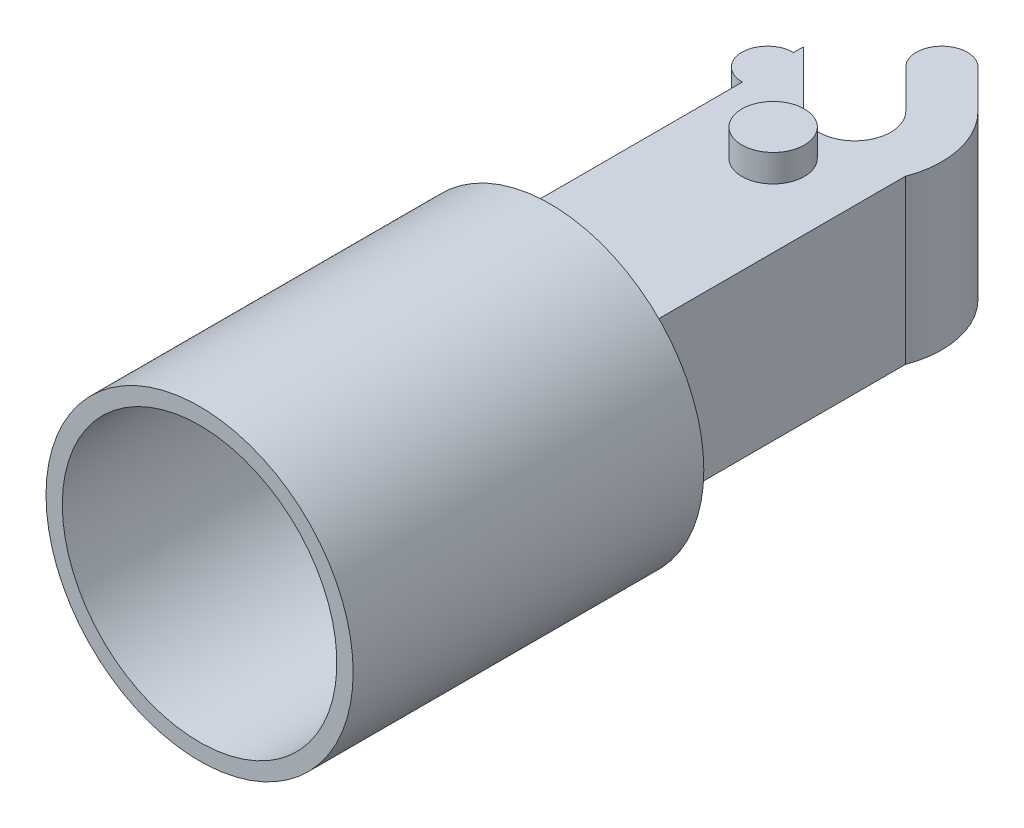
ISO-10303-21;
HEADER;
FILE_DESCRIPTION(('STEP AP214'),'2;1');
FILE_NAME('part.step','',(''),(''),'','','');
FILE_SCHEMA(('AUTOMOTIVE_DESIGN { 1 0 10303 214 1 1 1 1 }'));
ENDSEC;
DATA;
#1=APPLICATION_CONTEXT('core data for automotive mechanical design processes');
#2=APPLICATION_PROTOCOL_DEFINITION('international standard','automotive_design',2000,#1);
#3=PRODUCT_CONTEXT('',#1,'mechanical');
#4=PRODUCT('Part','Part','',(#3));
#5=PRODUCT_RELATED_PRODUCT_CATEGORY('part','',(#4));
#6=PRODUCT_DEFINITION_FORMATION('','',#4);
#7=PRODUCT_DEFINITION_CONTEXT('part definition',#1,'design');
#8=PRODUCT_DEFINITION('design','',#6,#7);
#9=PRODUCT_DEFINITION_SHAPE('','',#8);
#10=(LENGTH_UNIT() NAMED_UNIT(*) SI_UNIT(.MILLI.,.METRE.));
#11=(NAMED_UNIT(*) PLANE_ANGLE_UNIT() SI_UNIT($,.RADIAN.));
#12=(NAMED_UNIT(*) SI_UNIT($,.STERADIAN.) SOLID_ANGLE_UNIT());
#13=UNCERTAINTY_MEASURE_WITH_UNIT(LENGTH_MEASURE(1.E-05),#10,'distance_accuracy_value','');
#14=(GEOMETRIC_REPRESENTATION_CONTEXT(3) GLOBAL_UNCERTAINTY_ASSIGNED_CONTEXT((#13)) GLOBAL_UNIT_ASSIGNED_CONTEXT((#10,
#11,#12)) REPRESENTATION_CONTEXT('',''));
#15=CARTESIAN_POINT('',(0.,0.,0.));
#16=DIRECTION('',(0.,0.,1.));
#17=DIRECTION('',(1.,0.,0.));
#18=AXIS2_PLACEMENT_3D('',#15,#16,#17);
#19=CARTESIAN_POINT('',(-7.5,17.49,0.));
#20=DIRECTION('',(1.,0.,0.));
#21=DIRECTION('',(0.,0.,-1.));
#22=AXIS2_PLACEMENT_3D('',#19,#20,#21);
#23=PLANE('',#22);
#24=DIRECTION('',(0.,0.,1.));
#25=VECTOR('',#24,1.);
#26=CARTESIAN_POINT('',(-7.5,2.5,0.));
#27=LINE('',#26,#25);
#28=CARTESIAN_POINT('',(-7.5,2.5,-10.));
#29=VERTEX_POINT('',#28);
#30=CARTESIAN_POINT('',(-7.5,2.5,-9.37510898711377));
#31=VERTEX_POINT('',#30);
#32=EDGE_CURVE('E387',#29,#31,#27,.T.);
#33=ORIENTED_EDGE('',*,*,#32,.T.);
#34=DIRECTION('',(0.,-1.,0.));
#35=VECTOR('',#34,1.);
#36=CARTESIAN_POINT('',(-7.5,36.8519157616292,-9.37510898711377));
#37=LINE('',#36,#35);
#38=CARTESIAN_POINT('',(-7.5,17.49,-9.37510898711377));
#39=VERTEX_POINT('',#38);
#40=EDGE_CURVE('E477',#31,#39,#37,.F.);
#41=ORIENTED_EDGE('',*,*,#40,.T.);
#42=DIRECTION('',(0.,0.,1.));
#43=VECTOR('',#42,1.);
#44=CARTESIAN_POINT('',(-7.5,17.49,0.));
#45=LINE('',#44,#43);
#46=CARTESIAN_POINT('',(-7.5,17.49,-10.));
#47=VERTEX_POINT('',#46);
#48=EDGE_CURVE('E469',#47,#39,#45,.T.);
#49=ORIENTED_EDGE('',*,*,#48,.F.);
#50=DIRECTION('',(0.,-1.,0.));
#51=VECTOR('',#50,1.);
#52=CARTESIAN_POINT('',(-7.5,17.49,-10.));
#53=LINE('',#52,#51);
#54=EDGE_CURVE('E302',#47,#29,#53,.T.);
#55=ORIENTED_EDGE('',*,*,#54,.T.);
#56=EDGE_LOOP('',(#33,#41,#49,#55));
#57=FACE_BOUND('',#56,.T.);
#58=ADVANCED_FACE('F278',(#57),#23,.F.);
#59=CARTESIAN_POINT('',(0.,20.,0.));
#60=DIRECTION('',(0.,-1.,0.));
#61=DIRECTION('',(0.,0.,-1.));
#62=AXIS2_PLACEMENT_3D('',#59,#60,#61);
#63=CYLINDRICAL_SURFACE('',#62,2.875);
#64=CARTESIAN_POINT('',(0.,2.5,0.));
#65=DIRECTION('',(0.,-1.,0.));
#66=DIRECTION('',(0.,0.,-1.));
#67=AXIS2_PLACEMENT_3D('',#64,#65,#66);
#68=CIRCLE('',#67,2.875);
#69=CARTESIAN_POINT('',(0.,2.5,-2.875));
#70=VERTEX_POINT('',#69);
#71=EDGE_CURVE('E468',#70,#70,#68,.T.);
#72=ORIENTED_EDGE('',*,*,#71,.T.);
#73=EDGE_LOOP('',(#72));
#74=FACE_BOUND('',#73,.T.);
#75=CARTESIAN_POINT('',(0.,0.,0.));
#76=DIRECTION('',(0.,1.,0.));
#77=DIRECTION('',(0.,0.,1.));
#78=AXIS2_PLACEMENT_3D('',#75,#76,#77);
#79=CIRCLE('',#78,2.875);
#80=CARTESIAN_POINT('',(0.,0.,2.875));
#81=VERTEX_POINT('',#80);
#82=EDGE_CURVE('E401',#81,#81,#79,.T.);
#83=ORIENTED_EDGE('',*,*,#82,.T.);
#84=EDGE_LOOP('',(#83));
#85=FACE_BOUND('',#84,.T.);
#86=ADVANCED_FACE('F280',(#74,#85),#63,.T.);
#87=CARTESIAN_POINT('',(0.,0.,0.));
#88=DIRECTION('',(0.,1.,0.));
#89=DIRECTION('',(0.,0.,1.));
#90=AXIS2_PLACEMENT_3D('',#87,#88,#89);
#91=PLANE('',#90);
#92=ORIENTED_EDGE('',*,*,#82,.F.);
#93=EDGE_LOOP('',(#92));
#94=FACE_BOUND('',#93,.T.);
#95=ADVANCED_FACE('F435',(#94),#91,.F.);
#96=DIRECTION('',(0.,-1.,0.));
#97=VECTOR('',#96,1.);
#98=CARTESIAN_POINT('',(-7.5,42.8917715917611,20.5));
#99=LINE('',#98,#97);
#100=CARTESIAN_POINT('',(-7.5,17.49,20.5));
#101=VERTEX_POINT('',#100);
#102=CARTESIAN_POINT('',(-7.5,2.5,20.5));
#103=VERTEX_POINT('',#102);
#104=EDGE_CURVE('E393',#101,#103,#99,.T.);
#105=ORIENTED_EDGE('',*,*,#104,.F.);
#106=CARTESIAN_POINT('',(-7.5,17.49,-4.67599072275948));
#107=VERTEX_POINT('',#106);
#108=EDGE_CURVE('E452',#107,#101,#45,.T.);
#109=ORIENTED_EDGE('',*,*,#108,.F.);
#110=DIRECTION('',(0.,-1.,0.));
#111=VECTOR('',#110,1.);
#112=CARTESIAN_POINT('',(-7.5,36.8519157616292,-4.67599072275948));
#113=LINE('',#112,#111);
#114=CARTESIAN_POINT('',(-7.5,2.5,-4.67599072275948));
#115=VERTEX_POINT('',#114);
#116=EDGE_CURVE('E376',#107,#115,#113,.T.);
#117=ORIENTED_EDGE('',*,*,#116,.T.);
#118=EDGE_CURVE('E454',#115,#103,#27,.T.);
#119=ORIENTED_EDGE('',*,*,#118,.T.);
#120=EDGE_LOOP('',(#105,#109,#117,#119));
#121=FACE_BOUND('',#120,.T.);
#122=ADVANCED_FACE('F429',(#121),#23,.F.);
#123=CARTESIAN_POINT('',(7.5,17.49,0.));
#124=DIRECTION('',(-1.,0.,0.));
#125=DIRECTION('',(0.,0.,1.));
#126=AXIS2_PLACEMENT_3D('',#123,#124,#125);
#127=PLANE('',#126);
#128=DIRECTION('',(0.,0.,-1.));
#129=VECTOR('',#128,1.);
#130=CARTESIAN_POINT('',(7.5,2.5,0.));
#131=LINE('',#130,#129);
#132=CARTESIAN_POINT('',(7.5,2.5,20.5));
#133=VERTEX_POINT('',#132);
#134=CARTESIAN_POINT('',(7.5,2.5,-4.65924510790304));
#135=VERTEX_POINT('',#134);
#136=EDGE_CURVE('E390',#133,#135,#131,.T.);
#137=ORIENTED_EDGE('',*,*,#136,.T.);
#138=DIRECTION('',(0.,-1.,0.));
#139=VECTOR('',#138,1.);
#140=CARTESIAN_POINT('',(7.5,36.8519157616292,-4.65924510790304));
#141=LINE('',#140,#139);
#142=CARTESIAN_POINT('',(7.5,17.49,-4.65924510790304));
#143=VERTEX_POINT('',#142);
#144=EDGE_CURVE('E500',#135,#143,#141,.F.);
#145=ORIENTED_EDGE('',*,*,#144,.T.);
#146=DIRECTION('',(0.,0.,-1.));
#147=VECTOR('',#146,1.);
#148=CARTESIAN_POINT('',(7.5,17.49,0.));
#149=LINE('',#148,#147);
#150=CARTESIAN_POINT('',(7.5,17.49,20.5));
#151=VERTEX_POINT('',#150);
#152=EDGE_CURVE('E465',#151,#143,#149,.T.);
#153=ORIENTED_EDGE('',*,*,#152,.F.);
#154=DIRECTION('',(0.,-1.,0.));
#155=VECTOR('',#154,1.);
#156=CARTESIAN_POINT('',(7.5,42.8917715917611,20.5));
#157=LINE('',#156,#155);
#158=EDGE_CURVE('E458',#151,#133,#157,.T.);
#159=ORIENTED_EDGE('',*,*,#158,.T.);
#160=EDGE_LOOP('',(#137,#145,#153,#159));
#161=FACE_BOUND('',#160,.T.);
#162=ADVANCED_FACE('F440',(#161),#127,.F.);
#163=CARTESIAN_POINT('',(0.,2.5,0.));
#164=DIRECTION('',(0.,-1.,0.));
#165=DIRECTION('',(0.,0.,-1.));
#166=AXIS2_PLACEMENT_3D('',#163,#164,#165);
#167=PLANE('',#166);
#168=CARTESIAN_POINT('',(-5.75,2.5,-10.));
#169=DIRECTION('',(0.,-1.,0.));
#170=DIRECTION('',(0.,0.,-1.));
#171=AXIS2_PLACEMENT_3D('',#168,#169,#170);
#172=CIRCLE('',#171,1.75);
#173=CARTESIAN_POINT('',(-7.47752917134746,2.5,-10.279540627));
#174=VERTEX_POINT('',#173);
#175=EDGE_CURVE('E380',#29,#174,#172,.T.);
#176=ORIENTED_EDGE('',*,*,#175,.T.);
#177=DIRECTION('',(-0.707106781186547,0.,-0.707106781186548));
#178=VECTOR('',#177,1.);
#179=CARTESIAN_POINT('',(1.40100572782628,2.5,-1.40100572782628));
#180=LINE('',#179,#178);
#181=CARTESIAN_POINT('',(-2.34899427217372,2.5,-5.15100572782628));
#182=VERTEX_POINT('',#181);
#183=EDGE_CURVE('E367',#182,#174,#180,.T.);
#184=ORIENTED_EDGE('',*,*,#183,.F.);
#185=CARTESIAN_POINT('',(0.,2.5,-7.5));
#186=DIRECTION('',(0.,-1.,0.));
#187=DIRECTION('',(0.,0.,-1.));
#188=AXIS2_PLACEMENT_3D('',#185,#186,#187);
#189=CIRCLE('',#188,3.32197955764479);
#190=CARTESIAN_POINT('',(2.34899427217372,2.5,-9.84899427217372));
#191=VERTEX_POINT('',#190);
#192=EDGE_CURVE('E488',#191,#182,#189,.T.);
#193=ORIENTED_EDGE('',*,*,#192,.F.);
#194=DIRECTION('',(-0.707106781186548,0.,-0.707106781186547));
#195=VECTOR('',#194,1.);
#196=CARTESIAN_POINT('',(6.09899427217372,2.5,-6.09899427217372));
#197=LINE('',#196,#195);
#198=CARTESIAN_POINT('',(-1.18653963375902,2.5,-13.3845281781065));
#199=VERTEX_POINT('',#198);
#200=EDGE_CURVE('E548',#191,#199,#197,.T.);
#201=ORIENTED_EDGE('',*,*,#200,.T.);
#202=CARTESIAN_POINT('',(0.474450145063373,2.5,-15.0455179569289));
#203=DIRECTION('',(0.,-1.,0.));
#204=DIRECTION('',(0.,0.,-1.));
#205=AXIS2_PLACEMENT_3D('',#202,#203,#204);
#206=CIRCLE('',#205,2.34899427217372);
#207=CARTESIAN_POINT('',(2.13543992388577,2.5,-16.7065077357512));
#208=VERTEX_POINT('',#207);
#209=EDGE_CURVE('E492',#199,#208,#206,.T.);
#210=ORIENTED_EDGE('',*,*,#209,.T.);
#211=DIRECTION('',(-0.707106781186548,0.,-0.707106781186548));
#212=VECTOR('',#211,1.);
#213=CARTESIAN_POINT('',(9.42097382981851,2.5,-9.42097382981851));
#214=LINE('',#213,#212);
#215=CARTESIAN_POINT('',(5.67097382981851,2.5,-13.1709738298185));
#216=VERTEX_POINT('',#215);
#217=EDGE_CURVE('E525',#216,#208,#214,.T.);
#218=ORIENTED_EDGE('',*,*,#217,.F.);
#219=CARTESIAN_POINT('',(0.,2.5,-7.5));
#220=DIRECTION('',(0.,-1.,0.));
#221=DIRECTION('',(0.,0.,-1.));
#222=AXIS2_PLACEMENT_3D('',#219,#220,#221);
#223=CIRCLE('',#222,8.01996810199223);
#224=EDGE_CURVE('E486',#216,#135,#223,.T.);
#225=ORIENTED_EDGE('',*,*,#224,.T.);
#226=ORIENTED_EDGE('',*,*,#136,.F.);
#227=DIRECTION('',(-1.,0.,0.));
#228=VECTOR('',#227,1.);
#229=CARTESIAN_POINT('',(7.5,2.5,20.5));
#230=LINE('',#229,#228);
#231=EDGE_CURVE('E461',#133,#103,#230,.T.);
#232=ORIENTED_EDGE('',*,*,#231,.T.);
#233=ORIENTED_EDGE('',*,*,#118,.F.);
#234=CARTESIAN_POINT('',(-7.54551795692885,2.5,-7.02554985493662));
#235=DIRECTION('',(0.,-1.,0.));
#236=DIRECTION('',(0.,0.,-1.));
#237=AXIS2_PLACEMENT_3D('',#234,#235,#236);
#238=CIRCLE('',#237,2.35);
#239=EDGE_CURVE('E497',#115,#31,#238,.T.);
#240=ORIENTED_EDGE('',*,*,#239,.T.);
#241=ORIENTED_EDGE('',*,*,#32,.F.);
#242=EDGE_LOOP('',(#176,#184,#193,#201,#210,#218,#225,#226,#232,#233,#240,#241));
#243=FACE_BOUND('',#242,.T.);
#244=ORIENTED_EDGE('',*,*,#71,.F.);
#245=EDGE_LOOP('',(#244));
#246=FACE_BOUND('',#245,.T.);
#247=ADVANCED_FACE('F383',(#243,#246),#167,.T.);
#248=CARTESIAN_POINT('',(0.,17.49,0.));
#249=DIRECTION('',(0.,-1.,0.));
#250=DIRECTION('',(0.,0.,-1.));
#251=AXIS2_PLACEMENT_3D('',#248,#249,#250);
#252=PLANE('',#251);
#253=DIRECTION('',(0.707106781186547,0.,0.707106781186548));
#254=VECTOR('',#253,1.);
#255=CARTESIAN_POINT('',(1.40100572782628,17.49,-1.40100572782628));
#256=LINE('',#255,#254);
#257=CARTESIAN_POINT('',(-7.47752917134746,17.49,-10.279540627));
#258=VERTEX_POINT('',#257);
#259=CARTESIAN_POINT('',(-2.34899427217372,17.49,-5.15100572782628));
#260=VERTEX_POINT('',#259);
#261=EDGE_CURVE('E482',#258,#260,#256,.T.);
#262=ORIENTED_EDGE('',*,*,#261,.F.);
#263=CARTESIAN_POINT('',(-5.75,17.49,-10.));
#264=DIRECTION('',(0.,-1.,0.));
#265=DIRECTION('',(0.,0.,-1.));
#266=AXIS2_PLACEMENT_3D('',#263,#264,#265);
#267=CIRCLE('',#266,1.75);
#268=EDGE_CURVE('E382',#47,#258,#267,.T.);
#269=ORIENTED_EDGE('',*,*,#268,.F.);
#270=ORIENTED_EDGE('',*,*,#48,.T.);
#271=CARTESIAN_POINT('',(-7.54551795692885,17.49,-7.02554985493662));
#272=DIRECTION('',(0.,-1.,0.));
#273=DIRECTION('',(0.,0.,-1.));
#274=AXIS2_PLACEMENT_3D('',#271,#272,#273);
#275=CIRCLE('',#274,2.35);
#276=EDGE_CURVE('E293',#39,#107,#275,.F.);
#277=ORIENTED_EDGE('',*,*,#276,.T.);
#278=ORIENTED_EDGE('',*,*,#108,.T.);
#279=DIRECTION('',(1.,0.,0.));
#280=VECTOR('',#279,1.);
#281=CARTESIAN_POINT('',(7.5,17.49,20.5));
#282=LINE('',#281,#280);
#283=EDGE_CURVE('E388',#101,#151,#282,.T.);
#284=ORIENTED_EDGE('',*,*,#283,.T.);
#285=ORIENTED_EDGE('',*,*,#152,.T.);
#286=CARTESIAN_POINT('',(0.,17.49,-7.5));
#287=DIRECTION('',(0.,-1.,0.));
#288=DIRECTION('',(0.,0.,-1.));
#289=AXIS2_PLACEMENT_3D('',#286,#287,#288);
#290=CIRCLE('',#289,8.01996810199223);
#291=CARTESIAN_POINT('',(5.67097382981851,17.49,-13.1709738298185));
#292=VERTEX_POINT('',#291);
#293=EDGE_CURVE('E521',#143,#292,#290,.F.);
#294=ORIENTED_EDGE('',*,*,#293,.T.);
#295=DIRECTION('',(0.707106781186548,0.,0.707106781186548));
#296=VECTOR('',#295,1.);
#297=CARTESIAN_POINT('',(9.42097382981851,17.49,-9.42097382981851));
#298=LINE('',#297,#296);
#299=CARTESIAN_POINT('',(2.13543992388577,17.49,-16.7065077357512));
#300=VERTEX_POINT('',#299);
#301=EDGE_CURVE('E524',#300,#292,#298,.T.);
#302=ORIENTED_EDGE('',*,*,#301,.F.);
#303=CARTESIAN_POINT('',(0.474450145063373,17.49,-15.0455179569289));
#304=DIRECTION('',(0.,-1.,0.));
#305=DIRECTION('',(0.,0.,-1.));
#306=AXIS2_PLACEMENT_3D('',#303,#304,#305);
#307=CIRCLE('',#306,2.34899427217372);
#308=CARTESIAN_POINT('',(-1.18653963375902,17.49,-13.3845281781065));
#309=VERTEX_POINT('',#308);
#310=EDGE_CURVE('E377',#300,#309,#307,.F.);
#311=ORIENTED_EDGE('',*,*,#310,.T.);
#312=DIRECTION('',(0.707106781186548,0.,0.707106781186547));
#313=VECTOR('',#312,1.);
#314=CARTESIAN_POINT('',(6.09899427217372,17.49,-6.09899427217372));
#315=LINE('',#314,#313);
#316=CARTESIAN_POINT('',(2.34899427217372,17.49,-9.84899427217372));
#317=VERTEX_POINT('',#316);
#318=EDGE_CURVE('E503',#309,#317,#315,.T.);
#319=ORIENTED_EDGE('',*,*,#318,.T.);
#320=CARTESIAN_POINT('',(0.,17.49,-7.5));
#321=DIRECTION('',(0.,-1.,0.));
#322=DIRECTION('',(0.,0.,-1.));
#323=AXIS2_PLACEMENT_3D('',#320,#321,#322);
#324=CIRCLE('',#323,3.32197955764479);
#325=EDGE_CURVE('E485',#260,#317,#324,.F.);
#326=ORIENTED_EDGE('',*,*,#325,.F.);
#327=EDGE_LOOP('',(#262,#269,#270,#277,#278,#284,#285,#294,#302,#311,#319,#326));
#328=FACE_BOUND('',#327,.T.);
#329=CARTESIAN_POINT('',(0.,17.49,0.));
#330=DIRECTION('',(0.,-1.,0.));
#331=DIRECTION('',(0.,0.,-1.));
#332=AXIS2_PLACEMENT_3D('',#329,#330,#331);
#333=CIRCLE('',#332,2.875);
#334=CARTESIAN_POINT('',(0.,17.49,-2.875));
#335=VERTEX_POINT('',#334);
#336=EDGE_CURVE('E400',#335,#335,#333,.T.);
#337=ORIENTED_EDGE('',*,*,#336,.T.);
#338=EDGE_LOOP('',(#337));
#339=FACE_BOUND('',#338,.T.);
#340=ADVANCED_FACE('F479',(#328,#339),#252,.F.);
#341=CARTESIAN_POINT('',(-5.75,17.49,-10.));
#342=DIRECTION('',(0.,-1.,0.));
#343=DIRECTION('',(0.,0.,-1.));
#344=AXIS2_PLACEMENT_3D('',#341,#342,#343);
#345=CYLINDRICAL_SURFACE('',#344,1.75);
#346=DIRECTION('',(0.,-1.,0.));
#347=VECTOR('',#346,1.);
#348=CARTESIAN_POINT('',(-7.47752917134746,17.49,-10.279540627));
#349=LINE('',#348,#347);
#350=EDGE_CURVE('E12',#174,#258,#349,.F.);
#351=ORIENTED_EDGE('',*,*,#350,.F.);
#352=ORIENTED_EDGE('',*,*,#175,.F.);
#353=ORIENTED_EDGE('',*,*,#54,.F.);
#354=ORIENTED_EDGE('',*,*,#268,.T.);
#355=EDGE_LOOP('',(#351,#352,#353,#354));
#356=FACE_BOUND('',#355,.T.);
#357=ADVANCED_FACE('F379',(#356),#345,.T.);
#358=CARTESIAN_POINT('',(0.,20.,0.));
#359=DIRECTION('',(0.,1.,0.));
#360=DIRECTION('',(0.,0.,1.));
#361=AXIS2_PLACEMENT_3D('',#358,#359,#360);
#362=PLANE('',#361);
#363=CARTESIAN_POINT('',(0.,20.,0.));
#364=DIRECTION('',(0.,1.,0.));
#365=DIRECTION('',(0.,0.,1.));
#366=AXIS2_PLACEMENT_3D('',#363,#364,#365);
#367=CIRCLE('',#366,2.875);
#368=CARTESIAN_POINT('',(0.,20.,2.875));
#369=VERTEX_POINT('',#368);
#370=EDGE_CURVE('E397',#369,#369,#367,.T.);
#371=ORIENTED_EDGE('',*,*,#370,.T.);
#372=EDGE_LOOP('',(#371));
#373=FACE_BOUND('',#372,.T.);
#374=ADVANCED_FACE('F586',(#373),#362,.T.);
#375=ORIENTED_EDGE('',*,*,#370,.F.);
#376=EDGE_LOOP('',(#375));
#377=FACE_BOUND('',#376,.T.);
#378=ORIENTED_EDGE('',*,*,#336,.F.);
#379=EDGE_LOOP('',(#378));
#380=FACE_BOUND('',#379,.T.);
#381=ADVANCED_FACE('F437',(#377,#380),#63,.T.);
#382=CARTESIAN_POINT('',(0.,9.995,26.75));
#383=DIRECTION('',(0.,0.,-1.));
#384=DIRECTION('',(-1.,0.,0.));
#385=AXIS2_PLACEMENT_3D('',#382,#383,#384);
#386=CYLINDRICAL_SURFACE('',#385,14.125);
#387=CARTESIAN_POINT('',(0.,9.995,20.5));
#388=DIRECTION('',(0.,0.,1.));
#389=DIRECTION('',(1.,0.,0.));
#390=AXIS2_PLACEMENT_3D('',#387,#388,#389);
#391=CIRCLE('',#390,14.125);
#392=CARTESIAN_POINT('',(14.125,9.995,20.5));
#393=VERTEX_POINT('',#392);
#394=EDGE_CURVE('E511',#393,#393,#391,.T.);
#395=ORIENTED_EDGE('',*,*,#394,.T.);
#396=EDGE_LOOP('',(#395));
#397=FACE_BOUND('',#396,.T.);
#398=CARTESIAN_POINT('',(0.,9.995,52.75));
#399=DIRECTION('',(0.,0.,1.));
#400=DIRECTION('',(1.,0.,0.));
#401=AXIS2_PLACEMENT_3D('',#398,#399,#400);
#402=CIRCLE('',#401,14.125);
#403=CARTESIAN_POINT('',(14.125,9.995,52.75));
#404=VERTEX_POINT('',#403);
#405=EDGE_CURVE('E508',#404,#404,#402,.T.);
#406=ORIENTED_EDGE('',*,*,#405,.F.);
#407=EDGE_LOOP('',(#406));
#408=FACE_BOUND('',#407,.T.);
#409=ADVANCED_FACE('F575',(#397,#408),#386,.T.);
#410=CARTESIAN_POINT('',(0.,0.,20.5));
#411=DIRECTION('',(0.,0.,1.));
#412=DIRECTION('',(1.,0.,0.));
#413=AXIS2_PLACEMENT_3D('',#410,#411,#412);
#414=PLANE('',#413);
#415=ORIENTED_EDGE('',*,*,#283,.F.);
#416=ORIENTED_EDGE('',*,*,#104,.T.);
#417=ORIENTED_EDGE('',*,*,#231,.F.);
#418=ORIENTED_EDGE('',*,*,#158,.F.);
#419=EDGE_LOOP('',(#415,#416,#417,#418));
#420=FACE_BOUND('',#419,.T.);
#421=ORIENTED_EDGE('',*,*,#394,.F.);
#422=EDGE_LOOP('',(#421));
#423=FACE_BOUND('',#422,.T.);
#424=ADVANCED_FACE('F516',(#420,#423),#414,.F.);
#425=CARTESIAN_POINT('',(0.,9.995,52.75));
#426=DIRECTION('',(0.,0.,1.));
#427=DIRECTION('',(1.,0.,0.));
#428=AXIS2_PLACEMENT_3D('',#425,#426,#427);
#429=PLANE('',#428);
#430=ORIENTED_EDGE('',*,*,#405,.T.);
#431=EDGE_LOOP('',(#430));
#432=FACE_BOUND('',#431,.T.);
#433=CARTESIAN_POINT('',(0.,9.995,52.75));
#434=DIRECTION('',(0.,0.,1.));
#435=DIRECTION('',(1.,0.,0.));
#436=AXIS2_PLACEMENT_3D('',#433,#434,#435);
#437=CIRCLE('',#436,12.625);
#438=CARTESIAN_POINT('',(-12.625,9.995,52.75));
#439=VERTEX_POINT('',#438);
#440=EDGE_CURVE('E505',#439,#439,#437,.T.);
#441=ORIENTED_EDGE('',*,*,#440,.F.);
#442=EDGE_LOOP('',(#441));
#443=FACE_BOUND('',#442,.T.);
#444=ADVANCED_FACE('F421',(#432,#443),#429,.T.);
#445=CARTESIAN_POINT('',(0.,9.995,52.75));
#446=DIRECTION('',(0.,0.,-1.));
#447=DIRECTION('',(-1.,0.,0.));
#448=AXIS2_PLACEMENT_3D('',#445,#446,#447);
#449=CYLINDRICAL_SURFACE('',#448,12.625);
#450=CARTESIAN_POINT('',(0.,9.995,26.75));
#451=DIRECTION('',(0.,0.,1.));
#452=DIRECTION('',(1.,0.,0.));
#453=AXIS2_PLACEMENT_3D('',#450,#451,#452);
#454=CIRCLE('',#453,12.625);
#455=CARTESIAN_POINT('',(-12.625,9.995,26.75));
#456=VERTEX_POINT('',#455);
#457=EDGE_CURVE('E286',#456,#456,#454,.F.);
#458=CARTESIAN_POINT('',(-12.625,9.995,52.75));
#459=CARTESIAN_POINT('',(-12.625,9.995,52.4791666666667));
#460=CARTESIAN_POINT('',(-12.625,9.995,52.2083333333333));
#461=CARTESIAN_POINT('',(-12.625,9.995,51.6666666666667));
#462=CARTESIAN_POINT('',(-12.625,9.995,51.3958333333333));
#463=CARTESIAN_POINT('',(-12.625,9.995,50.8541666666667));
#464=CARTESIAN_POINT('',(-12.625,9.995,50.5833333333333));
#465=CARTESIAN_POINT('',(-12.625,9.995,50.0416666666667));
#466=CARTESIAN_POINT('',(-12.625,9.995,49.7708333333333));
#467=CARTESIAN_POINT('',(-12.625,9.995,49.2291666666667));
#468=CARTESIAN_POINT('',(-12.625,9.995,48.9583333333333));
#469=CARTESIAN_POINT('',(-12.625,9.995,48.4166666666667));
#470=CARTESIAN_POINT('',(-12.625,9.995,48.1458333333333));
#471=CARTESIAN_POINT('',(-12.625,9.995,47.6041666666667));
#472=CARTESIAN_POINT('',(-12.625,9.995,47.3333333333333));
#473=CARTESIAN_POINT('',(-12.625,9.995,46.7916666666667));
#474=CARTESIAN_POINT('',(-12.625,9.995,46.5208333333333));
#475=CARTESIAN_POINT('',(-12.625,9.995,45.9791666666667));
#476=CARTESIAN_POINT('',(-12.625,9.995,45.7083333333333));
#477=CARTESIAN_POINT('',(-12.625,9.995,45.1666666666667));
#478=CARTESIAN_POINT('',(-12.625,9.995,44.8958333333333));
#479=CARTESIAN_POINT('',(-12.625,9.995,44.3541666666667));
#480=CARTESIAN_POINT('',(-12.625,9.995,44.0833333333333));
#481=CARTESIAN_POINT('',(-12.625,9.995,43.5416666666667));
#482=CARTESIAN_POINT('',(-12.625,9.995,43.2708333333333));
#483=CARTESIAN_POINT('',(-12.625,9.995,42.7291666666667));
#484=CARTESIAN_POINT('',(-12.625,9.995,42.4583333333333));
#485=CARTESIAN_POINT('',(-12.625,9.995,41.9166666666667));
#486=CARTESIAN_POINT('',(-12.625,9.995,41.6458333333333));
#487=CARTESIAN_POINT('',(-12.625,9.995,41.1041666666667));
#488=CARTESIAN_POINT('',(-12.625,9.995,40.8333333333333));
#489=CARTESIAN_POINT('',(-12.625,9.995,40.2916666666667));
#490=CARTESIAN_POINT('',(-12.625,9.995,40.0208333333333));
#491=CARTESIAN_POINT('',(-12.625,9.995,39.4791666666667));
#492=CARTESIAN_POINT('',(-12.625,9.995,39.2083333333333));
#493=CARTESIAN_POINT('',(-12.625,9.995,38.6666666666667));
#494=CARTESIAN_POINT('',(-12.625,9.995,38.3958333333333));
#495=CARTESIAN_POINT('',(-12.625,9.995,37.8541666666667));
#496=CARTESIAN_POINT('',(-12.625,9.995,37.5833333333333));
#497=CARTESIAN_POINT('',(-12.625,9.995,37.0416666666667));
#498=CARTESIAN_POINT('',(-12.625,9.995,36.7708333333333));
#499=CARTESIAN_POINT('',(-12.625,9.995,36.2291666666667));
#500=CARTESIAN_POINT('',(-12.625,9.995,35.9583333333333));
#501=CARTESIAN_POINT('',(-12.625,9.995,35.4166666666667));
#502=CARTESIAN_POINT('',(-12.625,9.995,35.1458333333333));
#503=CARTESIAN_POINT('',(-12.625,9.995,34.6041666666667));
#504=CARTESIAN_POINT('',(-12.625,9.995,34.3333333333333));
#505=CARTESIAN_POINT('',(-12.625,9.995,33.7916666666667));
#506=CARTESIAN_POINT('',(-12.625,9.995,33.5208333333333));
#507=CARTESIAN_POINT('',(-12.625,9.995,32.9791666666667));
#508=CARTESIAN_POINT('',(-12.625,9.995,32.7083333333333));
#509=CARTESIAN_POINT('',(-12.625,9.995,32.1666666666667));
#510=CARTESIAN_POINT('',(-12.625,9.995,31.8958333333333));
#511=CARTESIAN_POINT('',(-12.625,9.995,31.3541666666667));
#512=CARTESIAN_POINT('',(-12.625,9.995,31.0833333333333));
#513=CARTESIAN_POINT('',(-12.625,9.995,30.5416666666667));
#514=CARTESIAN_POINT('',(-12.625,9.995,30.2708333333333));
#515=CARTESIAN_POINT('',(-12.625,9.995,29.7291666666667));
#516=CARTESIAN_POINT('',(-12.625,9.995,29.4583333333333));
#517=CARTESIAN_POINT('',(-12.625,9.995,28.9166666666667));
#518=CARTESIAN_POINT('',(-12.625,9.995,28.6458333333333));
#519=CARTESIAN_POINT('',(-12.625,9.995,28.1041666666667));
#520=CARTESIAN_POINT('',(-12.625,9.995,27.8333333333333));
#521=CARTESIAN_POINT('',(-12.625,9.995,27.2916666666667));
#522=CARTESIAN_POINT('',(-12.625,9.995,27.0208333333333));
#523=CARTESIAN_POINT('',(-12.625,9.995,26.75));
#524=B_SPLINE_CURVE_WITH_KNOTS('',3,(#458,#459,#460,#461,#462,#463,#464,#465,#466,#467,#468,
#469,#470,#471,#472,#473,#474,#475,#476,#477,#478,#479,#480,#481,#482,#483,#484,#485,#486,#487,
#488,#489,#490,#491,#492,#493,#494,#495,#496,#497,#498,#499,#500,#501,#502,#503,#504,#505,#506,
#507,#508,#509,#510,#511,#512,#513,#514,#515,#516,#517,#518,#519,#520,#521,#522,#523),
.UNSPECIFIED.,.F.,.F.,(4,2,2,2,2,2,2,2,2,2,2,2,2,2,2,2,2,2,2,2,2,2,2,2,2,2,2,2,2,2,2,2,4),(0.,
0.812499999999994,1.62499999999999,2.4375,3.25,4.0625,4.875,5.6875,6.5,7.3125,8.125,
8.93749999999999,9.74999999999999,10.5625,11.375,12.1875,13.,13.8125,14.625,15.4375,16.25,
17.0625,17.875,18.6875,19.5,20.3125,21.125,21.9375,22.75,23.5625,24.375,25.1875,26.),.UNSPECIFIED.);
#525=EDGE_CURVE('BSEAM408',#439,#456,#524,.T.);
#526=ORIENTED_EDGE('',*,*,#440,.T.);
#527=ORIENTED_EDGE('',*,*,#457,.T.);
#528=ORIENTED_EDGE('',*,*,#525,.T.);
#529=ORIENTED_EDGE('',*,*,#525,.F.);
#530=EDGE_LOOP('',(#526,#528,#527,#529));
#531=FACE_BOUND('',#530,.T.);
#532=ADVANCED_FACE('F408',(#531),#449,.F.);
#533=CARTESIAN_POINT('',(0.,0.,26.75));
#534=DIRECTION('',(0.,0.,1.));
#535=DIRECTION('',(1.,0.,0.));
#536=AXIS2_PLACEMENT_3D('',#533,#534,#535);
#537=PLANE('',#536);
#538=ORIENTED_EDGE('',*,*,#457,.F.);
#539=EDGE_LOOP('',(#538));
#540=FACE_BOUND('',#539,.T.);
#541=ADVANCED_FACE('F410',(#540),#537,.T.);
#542=CARTESIAN_POINT('',(0.,36.8519157616292,-7.5));
#543=DIRECTION('',(0.,-1.,0.));
#544=DIRECTION('',(0.,0.,-1.));
#545=AXIS2_PLACEMENT_3D('',#542,#543,#544);
#546=CYLINDRICAL_SURFACE('',#545,8.01996810199223);
#547=ORIENTED_EDGE('',*,*,#144,.F.);
#548=ORIENTED_EDGE('',*,*,#224,.F.);
#549=DIRECTION('',(0.,-1.,0.));
#550=VECTOR('',#549,1.);
#551=CARTESIAN_POINT('',(5.67097382981851,36.8519157616292,-13.1709738298185));
#552=LINE('',#551,#550);
#553=EDGE_CURVE('E528',#292,#216,#552,.T.);
#554=ORIENTED_EDGE('',*,*,#553,.F.);
#555=ORIENTED_EDGE('',*,*,#293,.F.);
#556=EDGE_LOOP('',(#547,#548,#554,#555));
#557=FACE_BOUND('',#556,.T.);
#558=ADVANCED_FACE('F412',(#557),#546,.T.);
#559=CARTESIAN_POINT('',(9.42097382981851,36.8519157616292,-9.42097382981851));
#560=DIRECTION('',(-0.707106781186548,0.,0.707106781186548));
#561=DIRECTION('',(0.707106781186548,0.,0.707106781186548));
#562=AXIS2_PLACEMENT_3D('',#559,#560,#561);
#563=PLANE('',#562);
#564=DIRECTION('',(0.,-1.,0.));
#565=VECTOR('',#564,1.);
#566=CARTESIAN_POINT('',(2.13543992388577,36.8519157616292,-16.7065077357512));
#567=LINE('',#566,#565);
#568=EDGE_CURVE('E533',#300,#208,#567,.T.);
#569=ORIENTED_EDGE('',*,*,#568,.F.);
#570=ORIENTED_EDGE('',*,*,#301,.T.);
#571=ORIENTED_EDGE('',*,*,#553,.T.);
#572=ORIENTED_EDGE('',*,*,#217,.T.);
#573=EDGE_LOOP('',(#569,#570,#571,#572));
#574=FACE_BOUND('',#573,.T.);
#575=ADVANCED_FACE('F418',(#574),#563,.F.);
#576=CARTESIAN_POINT('',(0.474450145063373,36.8519157616292,-15.0455179569289));
#577=DIRECTION('',(0.,-1.,0.));
#578=DIRECTION('',(0.,0.,-1.));
#579=AXIS2_PLACEMENT_3D('',#576,#577,#578);
#580=CYLINDRICAL_SURFACE('',#579,2.34899427217372);
#581=DIRECTION('',(0.,-1.,0.));
#582=VECTOR('',#581,1.);
#583=CARTESIAN_POINT('',(-1.18653963375902,36.8519157616292,-13.3845281781065));
#584=LINE('',#583,#582);
#585=EDGE_CURVE('E536',#309,#199,#584,.T.);
#586=ORIENTED_EDGE('',*,*,#585,.F.);
#587=ORIENTED_EDGE('',*,*,#310,.F.);
#588=ORIENTED_EDGE('',*,*,#568,.T.);
#589=ORIENTED_EDGE('',*,*,#209,.F.);
#590=EDGE_LOOP('',(#586,#587,#588,#589));
#591=FACE_BOUND('',#590,.T.);
#592=ADVANCED_FACE('F557',(#591),#580,.T.);
#593=CARTESIAN_POINT('',(6.09899427217372,36.8519157616292,-6.09899427217372));
#594=DIRECTION('',(-0.707106781186547,0.,0.707106781186548));
#595=DIRECTION('',(0.707106781186548,0.,0.707106781186547));
#596=AXIS2_PLACEMENT_3D('',#593,#594,#595);
#597=PLANE('',#596);
#598=ORIENTED_EDGE('',*,*,#318,.F.);
#599=ORIENTED_EDGE('',*,*,#585,.T.);
#600=ORIENTED_EDGE('',*,*,#200,.F.);
#601=DIRECTION('',(0.,-1.,0.));
#602=VECTOR('',#601,1.);
#603=CARTESIAN_POINT('',(2.34899427217372,36.8519157616292,-9.84899427217372));
#604=LINE('',#603,#602);
#605=EDGE_CURVE('E532',#317,#191,#604,.T.);
#606=ORIENTED_EDGE('',*,*,#605,.F.);
#607=EDGE_LOOP('',(#598,#599,#600,#606));
#608=FACE_BOUND('',#607,.T.);
#609=ADVANCED_FACE('F551',(#608),#597,.T.);
#610=CARTESIAN_POINT('',(0.,36.8519157616292,-7.5));
#611=DIRECTION('',(0.,-1.,0.));
#612=DIRECTION('',(0.,0.,-1.));
#613=AXIS2_PLACEMENT_3D('',#610,#611,#612);
#614=CYLINDRICAL_SURFACE('',#613,3.32197955764479);
#615=DIRECTION('',(0.,-1.,0.));
#616=VECTOR('',#615,1.);
#617=CARTESIAN_POINT('',(-2.34899427217372,36.8519157616292,-5.15100572782628));
#618=LINE('',#617,#616);
#619=EDGE_CURVE('E371',#260,#182,#618,.T.);
#620=ORIENTED_EDGE('',*,*,#619,.F.);
#621=ORIENTED_EDGE('',*,*,#325,.T.);
#622=ORIENTED_EDGE('',*,*,#605,.T.);
#623=ORIENTED_EDGE('',*,*,#192,.T.);
#624=EDGE_LOOP('',(#620,#621,#622,#623));
#625=FACE_BOUND('',#624,.T.);
#626=ADVANCED_FACE('F545',(#625),#614,.F.);
#627=CARTESIAN_POINT('',(1.40100572782628,36.8519157616292,-1.40100572782628));
#628=DIRECTION('',(-0.707106781186548,0.,0.707106781186547));
#629=DIRECTION('',(0.707106781186547,0.,0.707106781186548));
#630=AXIS2_PLACEMENT_3D('',#627,#628,#629);
#631=PLANE('',#630);
#632=ORIENTED_EDGE('',*,*,#183,.T.);
#633=ORIENTED_EDGE('',*,*,#350,.T.);
#634=ORIENTED_EDGE('',*,*,#261,.T.);
#635=ORIENTED_EDGE('',*,*,#619,.T.);
#636=EDGE_LOOP('',(#632,#633,#634,#635));
#637=FACE_BOUND('',#636,.T.);
#638=ADVANCED_FACE('F369',(#637),#631,.F.);
#639=CARTESIAN_POINT('',(-7.54551795692885,36.8519157616292,-7.02554985493662));
#640=DIRECTION('',(0.,-1.,0.));
#641=DIRECTION('',(0.,0.,-1.));
#642=AXIS2_PLACEMENT_3D('',#639,#640,#641);
#643=CYLINDRICAL_SURFACE('',#642,2.35);
#644=ORIENTED_EDGE('',*,*,#40,.F.);
#645=ORIENTED_EDGE('',*,*,#239,.F.);
#646=ORIENTED_EDGE('',*,*,#116,.F.);
#647=ORIENTED_EDGE('',*,*,#276,.F.);
#648=EDGE_LOOP('',(#644,#645,#646,#647));
#649=FACE_BOUND('',#648,.T.);
#650=ADVANCED_FACE('F568',(#649),#643,.T.);
#651=CLOSED_SHELL('',(#58,#86,#95,#122,#162,#247,#340,#357,#374,#381,#409,#424,#444,#532,#541,
#558,#575,#592,#609,#626,#638,#650));
#652=MANIFOLD_SOLID_BREP('B2',#651);
#653=ADVANCED_BREP_SHAPE_REPRESENTATION('',(#18,#652),#14);
#654=SHAPE_DEFINITION_REPRESENTATION(#9,#653);
ENDSEC;
END-ISO-10303-21;
